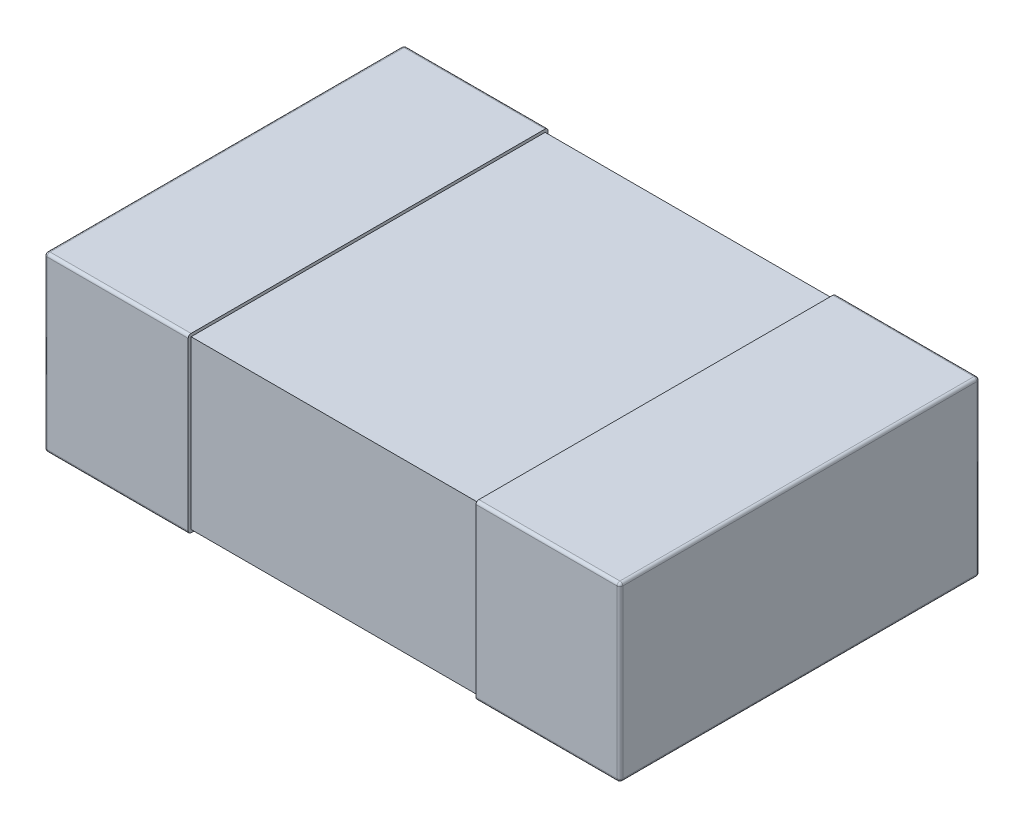
ISO-10303-21;
HEADER;
FILE_DESCRIPTION(('STEP AP214'),'2;1');
FILE_NAME('part.step','',(''),(''),'','','');
FILE_SCHEMA(('AUTOMOTIVE_DESIGN { 1 0 10303 214 1 1 1 1 }'));
ENDSEC;
DATA;
#1=APPLICATION_CONTEXT('core data for automotive mechanical design processes');
#2=APPLICATION_PROTOCOL_DEFINITION('international standard','automotive_design',2000,#1);
#3=PRODUCT_CONTEXT('',#1,'mechanical');
#4=PRODUCT('Part','Part','',(#3));
#5=PRODUCT_RELATED_PRODUCT_CATEGORY('part','',(#4));
#6=PRODUCT_DEFINITION_FORMATION('','',#4);
#7=PRODUCT_DEFINITION_CONTEXT('part definition',#1,'design');
#8=PRODUCT_DEFINITION('design','',#6,#7);
#9=PRODUCT_DEFINITION_SHAPE('','',#8);
#10=(LENGTH_UNIT() NAMED_UNIT(*) SI_UNIT(.MILLI.,.METRE.));
#11=(NAMED_UNIT(*) PLANE_ANGLE_UNIT() SI_UNIT($,.RADIAN.));
#12=(NAMED_UNIT(*) SI_UNIT($,.STERADIAN.) SOLID_ANGLE_UNIT());
#13=UNCERTAINTY_MEASURE_WITH_UNIT(LENGTH_MEASURE(1.E-05),#10,'distance_accuracy_value','');
#14=(GEOMETRIC_REPRESENTATION_CONTEXT(3) GLOBAL_UNCERTAINTY_ASSIGNED_CONTEXT((#13)) GLOBAL_UNIT_ASSIGNED_CONTEXT((#10,
#11,#12)) REPRESENTATION_CONTEXT('',''));
#15=CARTESIAN_POINT('',(0.,0.,0.));
#16=DIRECTION('',(0.,0.,1.));
#17=DIRECTION('',(1.,0.,0.));
#18=AXIS2_PLACEMENT_3D('',#15,#16,#17);
#19=CARTESIAN_POINT('',(-1.,0.3,-0.625));
#20=DIRECTION('',(1.,0.,0.));
#21=DIRECTION('',(0.,0.,-1.));
#22=AXIS2_PLACEMENT_3D('',#19,#20,#21);
#23=PLANE('',#22);
#24=DIRECTION('',(0.,-1.,0.));
#25=VECTOR('',#24,1.);
#26=CARTESIAN_POINT('',(-1.,0.3,-0.615));
#27=LINE('',#26,#25);
#28=CARTESIAN_POINT('',(-1.,0.29,-0.615));
#29=VERTEX_POINT('',#28);
#30=CARTESIAN_POINT('',(-1.,-0.29,-0.615));
#31=VERTEX_POINT('',#30);
#32=EDGE_CURVE('E347',#29,#31,#27,.T.);
#33=ORIENTED_EDGE('',*,*,#32,.T.);
#34=DIRECTION('',(0.,0.,1.));
#35=VECTOR('',#34,1.);
#36=CARTESIAN_POINT('',(-1.,-0.29,-0.625));
#37=LINE('',#36,#35);
#38=CARTESIAN_POINT('',(-1.,-0.29,0.615));
#39=VERTEX_POINT('',#38);
#40=EDGE_CURVE('E349',#31,#39,#37,.T.);
#41=ORIENTED_EDGE('',*,*,#40,.T.);
#42=DIRECTION('',(0.,-1.,0.));
#43=VECTOR('',#42,1.);
#44=CARTESIAN_POINT('',(-1.,0.3,0.615));
#45=LINE('',#44,#43);
#46=CARTESIAN_POINT('',(-1.,0.29,0.615));
#47=VERTEX_POINT('',#46);
#48=EDGE_CURVE('E345',#39,#47,#45,.F.);
#49=ORIENTED_EDGE('',*,*,#48,.T.);
#50=DIRECTION('',(0.,0.,1.));
#51=VECTOR('',#50,1.);
#52=CARTESIAN_POINT('',(-1.,0.29,-0.625));
#53=LINE('',#52,#51);
#54=EDGE_CURVE('E343',#47,#29,#53,.F.);
#55=ORIENTED_EDGE('',*,*,#54,.T.);
#56=EDGE_LOOP('',(#33,#41,#49,#55));
#57=FACE_BOUND('',#56,.T.);
#58=ADVANCED_FACE('F32',(#57),#23,.F.);
#59=CARTESIAN_POINT('',(-1.,0.3,0.625));
#60=DIRECTION('',(0.,0.,-1.));
#61=DIRECTION('',(-1.,0.,0.));
#62=AXIS2_PLACEMENT_3D('',#59,#60,#61);
#63=PLANE('',#62);
#64=DIRECTION('',(0.,-1.,0.));
#65=VECTOR('',#64,1.);
#66=CARTESIAN_POINT('',(-0.99,0.3,0.625));
#67=LINE('',#66,#65);
#68=CARTESIAN_POINT('',(-0.99,0.29,0.625));
#69=VERTEX_POINT('',#68);
#70=CARTESIAN_POINT('',(-0.99,-0.29,0.625));
#71=VERTEX_POINT('',#70);
#72=EDGE_CURVE('E375',#69,#71,#67,.T.);
#73=ORIENTED_EDGE('',*,*,#72,.T.);
#74=DIRECTION('',(1.,0.,0.));
#75=VECTOR('',#74,1.);
#76=CARTESIAN_POINT('',(-1.,-0.29,0.625));
#77=LINE('',#76,#75);
#78=CARTESIAN_POINT('',(-0.5,-0.29,0.625));
#79=VERTEX_POINT('',#78);
#80=EDGE_CURVE('E377',#71,#79,#77,.T.);
#81=ORIENTED_EDGE('',*,*,#80,.T.);
#82=DIRECTION('',(0.,-1.,0.));
#83=VECTOR('',#82,1.);
#84=CARTESIAN_POINT('',(-0.5,0.3,0.625));
#85=LINE('',#84,#83);
#86=CARTESIAN_POINT('',(-0.5,0.29,0.625));
#87=VERTEX_POINT('',#86);
#88=EDGE_CURVE('E340',#87,#79,#85,.T.);
#89=ORIENTED_EDGE('',*,*,#88,.F.);
#90=DIRECTION('',(1.,0.,0.));
#91=VECTOR('',#90,1.);
#92=CARTESIAN_POINT('',(-1.,0.29,0.625));
#93=LINE('',#92,#91);
#94=EDGE_CURVE('E373',#87,#69,#93,.F.);
#95=ORIENTED_EDGE('',*,*,#94,.T.);
#96=EDGE_LOOP('',(#73,#81,#89,#95));
#97=FACE_BOUND('',#96,.T.);
#98=ADVANCED_FACE('F446',(#97),#63,.F.);
#99=CARTESIAN_POINT('',(-0.5,0.3,-0.625));
#100=DIRECTION('',(-1.,0.,0.));
#101=DIRECTION('',(0.,0.,1.));
#102=AXIS2_PLACEMENT_3D('',#99,#100,#101);
#103=PLANE('',#102);
#104=DIRECTION('',(0.,1.,0.));
#105=VECTOR('',#104,1.);
#106=CARTESIAN_POINT('',(-0.5,0.29,-0.615));
#107=LINE('',#106,#105);
#108=CARTESIAN_POINT('',(-0.5,-0.29,-0.615));
#109=VERTEX_POINT('',#108);
#110=CARTESIAN_POINT('',(-0.5,0.29,-0.615));
#111=VERTEX_POINT('',#110);
#112=EDGE_CURVE('E206',#109,#111,#107,.T.);
#113=ORIENTED_EDGE('',*,*,#112,.F.);
#114=DIRECTION('',(0.,0.,-1.));
#115=VECTOR('',#114,1.);
#116=CARTESIAN_POINT('',(-0.5,-0.29,0.615));
#117=LINE('',#116,#115);
#118=CARTESIAN_POINT('',(-0.5,-0.29,0.615));
#119=VERTEX_POINT('',#118);
#120=EDGE_CURVE('E201',#119,#109,#117,.T.);
#121=ORIENTED_EDGE('',*,*,#120,.F.);
#122=DIRECTION('',(0.,-1.,0.));
#123=VECTOR('',#122,1.);
#124=CARTESIAN_POINT('',(-0.5,0.29,0.615));
#125=LINE('',#124,#123);
#126=CARTESIAN_POINT('',(-0.5,0.29,0.615));
#127=VERTEX_POINT('',#126);
#128=EDGE_CURVE('E322',#127,#119,#125,.T.);
#129=ORIENTED_EDGE('',*,*,#128,.F.);
#130=DIRECTION('',(0.,0.,1.));
#131=VECTOR('',#130,1.);
#132=CARTESIAN_POINT('',(-0.5,0.29,0.615));
#133=LINE('',#132,#131);
#134=EDGE_CURVE('E49',#111,#127,#133,.T.);
#135=ORIENTED_EDGE('',*,*,#134,.F.);
#136=EDGE_LOOP('',(#113,#121,#129,#135));
#137=FACE_BOUND('',#136,.T.);
#138=DIRECTION('',(0.,0.,-1.));
#139=VECTOR('',#138,1.);
#140=CARTESIAN_POINT('',(-0.5,-0.3,-0.625));
#141=LINE('',#140,#139);
#142=CARTESIAN_POINT('',(-0.5,-0.3,0.615));
#143=VERTEX_POINT('',#142);
#144=CARTESIAN_POINT('',(-0.5,-0.3,-0.615));
#145=VERTEX_POINT('',#144);
#146=EDGE_CURVE('E335',#143,#145,#141,.T.);
#147=ORIENTED_EDGE('',*,*,#146,.T.);
#148=CARTESIAN_POINT('',(-0.5,-0.29,-0.615));
#149=DIRECTION('',(-1.,0.,0.));
#150=DIRECTION('',(0.,0.,1.));
#151=AXIS2_PLACEMENT_3D('',#148,#149,#150);
#152=CIRCLE('',#151,0.01);
#153=CARTESIAN_POINT('',(-0.5,-0.29,-0.625));
#154=VERTEX_POINT('',#153);
#155=EDGE_CURVE('E371',#145,#154,#152,.F.);
#156=ORIENTED_EDGE('',*,*,#155,.T.);
#157=DIRECTION('',(0.,-1.,0.));
#158=VECTOR('',#157,1.);
#159=CARTESIAN_POINT('',(-0.5,0.3,-0.625));
#160=LINE('',#159,#158);
#161=CARTESIAN_POINT('',(-0.5,0.29,-0.625));
#162=VERTEX_POINT('',#161);
#163=EDGE_CURVE('E334',#162,#154,#160,.T.);
#164=ORIENTED_EDGE('',*,*,#163,.F.);
#165=CARTESIAN_POINT('',(-0.5,0.29,-0.615));
#166=DIRECTION('',(-1.,0.,0.));
#167=DIRECTION('',(0.,0.,1.));
#168=AXIS2_PLACEMENT_3D('',#165,#166,#167);
#169=CIRCLE('',#168,0.01);
#170=CARTESIAN_POINT('',(-0.5,0.3,-0.615));
#171=VERTEX_POINT('',#170);
#172=EDGE_CURVE('E367',#162,#171,#169,.F.);
#173=ORIENTED_EDGE('',*,*,#172,.T.);
#174=DIRECTION('',(0.,0.,-1.));
#175=VECTOR('',#174,1.);
#176=CARTESIAN_POINT('',(-0.5,0.3,-0.625));
#177=LINE('',#176,#175);
#178=CARTESIAN_POINT('',(-0.5,0.3,0.615));
#179=VERTEX_POINT('',#178);
#180=EDGE_CURVE('E332',#179,#171,#177,.T.);
#181=ORIENTED_EDGE('',*,*,#180,.F.);
#182=CARTESIAN_POINT('',(-0.5,0.29,0.615));
#183=DIRECTION('',(-1.,0.,0.));
#184=DIRECTION('',(0.,0.,1.));
#185=AXIS2_PLACEMENT_3D('',#182,#183,#184);
#186=CIRCLE('',#185,0.01);
#187=EDGE_CURVE('E365',#179,#87,#186,.F.);
#188=ORIENTED_EDGE('',*,*,#187,.T.);
#189=ORIENTED_EDGE('',*,*,#88,.T.);
#190=CARTESIAN_POINT('',(-0.5,-0.29,0.615));
#191=DIRECTION('',(-1.,0.,0.));
#192=DIRECTION('',(0.,0.,1.));
#193=AXIS2_PLACEMENT_3D('',#190,#191,#192);
#194=CIRCLE('',#193,0.01);
#195=EDGE_CURVE('E369',#79,#143,#194,.F.);
#196=ORIENTED_EDGE('',*,*,#195,.T.);
#197=EDGE_LOOP('',(#147,#156,#164,#173,#181,#188,#189,#196));
#198=FACE_BOUND('',#197,.T.);
#199=ADVANCED_FACE('F443',(#137,#198),#103,.F.);
#200=CARTESIAN_POINT('',(-1.,0.3,-0.625));
#201=DIRECTION('',(0.,0.,1.));
#202=DIRECTION('',(1.,0.,0.));
#203=AXIS2_PLACEMENT_3D('',#200,#201,#202);
#204=PLANE('',#203);
#205=ORIENTED_EDGE('',*,*,#163,.T.);
#206=DIRECTION('',(-1.,0.,0.));
#207=VECTOR('',#206,1.);
#208=CARTESIAN_POINT('',(-1.,-0.29,-0.625));
#209=LINE('',#208,#207);
#210=CARTESIAN_POINT('',(-0.99,-0.29,-0.625));
#211=VERTEX_POINT('',#210);
#212=EDGE_CURVE('E363',#154,#211,#209,.T.);
#213=ORIENTED_EDGE('',*,*,#212,.T.);
#214=DIRECTION('',(0.,-1.,0.));
#215=VECTOR('',#214,1.);
#216=CARTESIAN_POINT('',(-0.99,0.3,-0.625));
#217=LINE('',#216,#215);
#218=CARTESIAN_POINT('',(-0.99,0.29,-0.625));
#219=VERTEX_POINT('',#218);
#220=EDGE_CURVE('E361',#211,#219,#217,.F.);
#221=ORIENTED_EDGE('',*,*,#220,.T.);
#222=DIRECTION('',(-1.,0.,0.));
#223=VECTOR('',#222,1.);
#224=CARTESIAN_POINT('',(-0.5,0.29,-0.625));
#225=LINE('',#224,#223);
#226=EDGE_CURVE('E359',#219,#162,#225,.F.);
#227=ORIENTED_EDGE('',*,*,#226,.T.);
#228=EDGE_LOOP('',(#205,#213,#221,#227));
#229=FACE_BOUND('',#228,.T.);
#230=ADVANCED_FACE('F472',(#229),#204,.F.);
#231=CARTESIAN_POINT('',(-1.,0.3,0.625));
#232=DIRECTION('',(0.,1.,0.));
#233=DIRECTION('',(0.,0.,1.));
#234=AXIS2_PLACEMENT_3D('',#231,#232,#233);
#235=PLANE('',#234);
#236=ORIENTED_EDGE('',*,*,#180,.T.);
#237=DIRECTION('',(-1.,0.,0.));
#238=VECTOR('',#237,1.);
#239=CARTESIAN_POINT('',(-1.,0.3,-0.615));
#240=LINE('',#239,#238);
#241=CARTESIAN_POINT('',(-0.99,0.3,-0.615));
#242=VERTEX_POINT('',#241);
#243=EDGE_CURVE('E11',#171,#242,#240,.T.);
#244=ORIENTED_EDGE('',*,*,#243,.T.);
#245=DIRECTION('',(0.,0.,1.));
#246=VECTOR('',#245,1.);
#247=CARTESIAN_POINT('',(-0.99,0.3,0.625));
#248=LINE('',#247,#246);
#249=CARTESIAN_POINT('',(-0.99,0.3,0.615));
#250=VERTEX_POINT('',#249);
#251=EDGE_CURVE('E41',#242,#250,#248,.T.);
#252=ORIENTED_EDGE('',*,*,#251,.T.);
#253=DIRECTION('',(1.,0.,0.));
#254=VECTOR('',#253,1.);
#255=CARTESIAN_POINT('',(-0.5,0.3,0.615));
#256=LINE('',#255,#254);
#257=EDGE_CURVE('E379',#250,#179,#256,.T.);
#258=ORIENTED_EDGE('',*,*,#257,.T.);
#259=EDGE_LOOP('',(#236,#244,#252,#258));
#260=FACE_BOUND('',#259,.T.);
#261=ADVANCED_FACE('F433',(#260),#235,.T.);
#262=CARTESIAN_POINT('',(-1.,-0.3,0.625));
#263=DIRECTION('',(0.,1.,0.));
#264=DIRECTION('',(0.,0.,1.));
#265=AXIS2_PLACEMENT_3D('',#262,#263,#264);
#266=PLANE('',#265);
#267=DIRECTION('',(0.,0.,1.));
#268=VECTOR('',#267,1.);
#269=CARTESIAN_POINT('',(-0.99,-0.3,0.625));
#270=LINE('',#269,#268);
#271=CARTESIAN_POINT('',(-0.99,-0.3,0.615));
#272=VERTEX_POINT('',#271);
#273=CARTESIAN_POINT('',(-0.99,-0.3,-0.615));
#274=VERTEX_POINT('',#273);
#275=EDGE_CURVE('E354',#272,#274,#270,.F.);
#276=ORIENTED_EDGE('',*,*,#275,.T.);
#277=DIRECTION('',(-1.,0.,0.));
#278=VECTOR('',#277,1.);
#279=CARTESIAN_POINT('',(-1.,-0.3,-0.615));
#280=LINE('',#279,#278);
#281=EDGE_CURVE('E357',#274,#145,#280,.F.);
#282=ORIENTED_EDGE('',*,*,#281,.T.);
#283=ORIENTED_EDGE('',*,*,#146,.F.);
#284=DIRECTION('',(1.,0.,0.));
#285=VECTOR('',#284,1.);
#286=CARTESIAN_POINT('',(-1.,-0.3,0.615));
#287=LINE('',#286,#285);
#288=EDGE_CURVE('E352',#143,#272,#287,.F.);
#289=ORIENTED_EDGE('',*,*,#288,.T.);
#290=EDGE_LOOP('',(#276,#282,#283,#289));
#291=FACE_BOUND('',#290,.T.);
#292=ADVANCED_FACE('F463',(#291),#266,.F.);
#293=CARTESIAN_POINT('',(-1.,0.29,-0.615));
#294=DIRECTION('',(1.,0.,0.));
#295=DIRECTION('',(0.,0.,-1.));
#296=AXIS2_PLACEMENT_3D('',#293,#294,#295);
#297=CYLINDRICAL_SURFACE('',#296,0.01);
#298=ORIENTED_EDGE('',*,*,#172,.F.);
#299=ORIENTED_EDGE('',*,*,#226,.F.);
#300=CARTESIAN_POINT('',(-0.99,0.29,-0.615));
#301=DIRECTION('',(-1.,0.,0.));
#302=DIRECTION('',(0.,0.,1.));
#303=AXIS2_PLACEMENT_3D('',#300,#301,#302);
#304=CIRCLE('',#303,0.01);
#305=EDGE_CURVE('E36',#242,#219,#304,.T.);
#306=ORIENTED_EDGE('',*,*,#305,.F.);
#307=ORIENTED_EDGE('',*,*,#243,.F.);
#308=EDGE_LOOP('',(#298,#299,#306,#307));
#309=FACE_BOUND('',#308,.T.);
#310=ADVANCED_FACE('F34',(#309),#297,.T.);
#311=CARTESIAN_POINT('',(-0.99,0.29,0.625));
#312=DIRECTION('',(0.,0.,-1.));
#313=DIRECTION('',(-1.,0.,0.));
#314=AXIS2_PLACEMENT_3D('',#311,#312,#313);
#315=CYLINDRICAL_SURFACE('',#314,0.01);
#316=CARTESIAN_POINT('',(-0.99,0.29,0.615));
#317=DIRECTION('',(0.,0.,1.));
#318=DIRECTION('',(1.,0.,0.));
#319=AXIS2_PLACEMENT_3D('',#316,#317,#318);
#320=CIRCLE('',#319,0.01);
#321=EDGE_CURVE('E406',#250,#47,#320,.T.);
#322=ORIENTED_EDGE('',*,*,#321,.F.);
#323=ORIENTED_EDGE('',*,*,#251,.F.);
#324=CARTESIAN_POINT('',(-0.99,0.29,-0.615));
#325=DIRECTION('',(0.,0.,-1.));
#326=DIRECTION('',(-1.,0.,0.));
#327=AXIS2_PLACEMENT_3D('',#324,#325,#326);
#328=CIRCLE('',#327,0.01);
#329=EDGE_CURVE('E408',#29,#242,#328,.T.);
#330=ORIENTED_EDGE('',*,*,#329,.F.);
#331=ORIENTED_EDGE('',*,*,#54,.F.);
#332=EDGE_LOOP('',(#322,#323,#330,#331));
#333=FACE_BOUND('',#332,.T.);
#334=ADVANCED_FACE('F431',(#333),#315,.T.);
#335=CARTESIAN_POINT('',(-1.,0.29,0.615));
#336=DIRECTION('',(-1.,0.,0.));
#337=DIRECTION('',(0.,0.,1.));
#338=AXIS2_PLACEMENT_3D('',#335,#336,#337);
#339=CYLINDRICAL_SURFACE('',#338,0.01);
#340=ORIENTED_EDGE('',*,*,#187,.F.);
#341=ORIENTED_EDGE('',*,*,#257,.F.);
#342=CARTESIAN_POINT('',(-0.99,0.29,0.615));
#343=DIRECTION('',(-1.,0.,0.));
#344=DIRECTION('',(0.,0.,1.));
#345=AXIS2_PLACEMENT_3D('',#342,#343,#344);
#346=CIRCLE('',#345,0.01);
#347=EDGE_CURVE('E403',#69,#250,#346,.T.);
#348=ORIENTED_EDGE('',*,*,#347,.F.);
#349=ORIENTED_EDGE('',*,*,#94,.F.);
#350=EDGE_LOOP('',(#340,#341,#348,#349));
#351=FACE_BOUND('',#350,.T.);
#352=ADVANCED_FACE('F438',(#351),#339,.T.);
#353=CARTESIAN_POINT('',(-0.99,0.29,-0.615));
#354=DIRECTION('',(0.,0.,1.));
#355=DIRECTION('',(1.,0.,0.));
#356=AXIS2_PLACEMENT_3D('',#353,#354,#355);
#357=SPHERICAL_SURFACE('',#356,0.01);
#358=ORIENTED_EDGE('',*,*,#329,.T.);
#359=ORIENTED_EDGE('',*,*,#305,.T.);
#360=CARTESIAN_POINT('',(-0.99,0.29,-0.615));
#361=DIRECTION('',(0.,1.,0.));
#362=DIRECTION('',(0.,0.,1.));
#363=AXIS2_PLACEMENT_3D('',#360,#361,#362);
#364=CIRCLE('',#363,0.01);
#365=EDGE_CURVE('E400',#29,#219,#364,.F.);
#366=ORIENTED_EDGE('',*,*,#365,.F.);
#367=EDGE_LOOP('',(#358,#359,#366));
#368=FACE_BOUND('',#367,.T.);
#369=ADVANCED_FACE('F415',(#368),#357,.T.);
#370=CARTESIAN_POINT('',(-0.99,0.29,0.615));
#371=DIRECTION('',(0.,0.,1.));
#372=DIRECTION('',(1.,0.,0.));
#373=AXIS2_PLACEMENT_3D('',#370,#371,#372);
#374=SPHERICAL_SURFACE('',#373,0.01);
#375=ORIENTED_EDGE('',*,*,#347,.T.);
#376=ORIENTED_EDGE('',*,*,#321,.T.);
#377=CARTESIAN_POINT('',(-0.99,0.29,0.615));
#378=DIRECTION('',(0.,1.,0.));
#379=DIRECTION('',(0.,0.,1.));
#380=AXIS2_PLACEMENT_3D('',#377,#378,#379);
#381=CIRCLE('',#380,0.01);
#382=EDGE_CURVE('E397',#69,#47,#381,.F.);
#383=ORIENTED_EDGE('',*,*,#382,.F.);
#384=EDGE_LOOP('',(#375,#376,#383));
#385=FACE_BOUND('',#384,.T.);
#386=ADVANCED_FACE('F504',(#385),#374,.T.);
#387=CARTESIAN_POINT('',(-1.,-0.29,-0.615));
#388=DIRECTION('',(-1.,0.,0.));
#389=DIRECTION('',(0.,0.,1.));
#390=AXIS2_PLACEMENT_3D('',#387,#388,#389);
#391=CYLINDRICAL_SURFACE('',#390,0.01);
#392=ORIENTED_EDGE('',*,*,#155,.F.);
#393=ORIENTED_EDGE('',*,*,#281,.F.);
#394=CARTESIAN_POINT('',(-0.99,-0.29,-0.615));
#395=DIRECTION('',(-1.,0.,0.));
#396=DIRECTION('',(0.,0.,1.));
#397=AXIS2_PLACEMENT_3D('',#394,#395,#396);
#398=CIRCLE('',#397,0.01);
#399=EDGE_CURVE('E394',#211,#274,#398,.T.);
#400=ORIENTED_EDGE('',*,*,#399,.F.);
#401=ORIENTED_EDGE('',*,*,#212,.F.);
#402=EDGE_LOOP('',(#392,#393,#400,#401));
#403=FACE_BOUND('',#402,.T.);
#404=ADVANCED_FACE('F470',(#403),#391,.T.);
#405=CARTESIAN_POINT('',(-0.99,0.3,-0.615));
#406=DIRECTION('',(0.,-1.,0.));
#407=DIRECTION('',(0.,0.,-1.));
#408=AXIS2_PLACEMENT_3D('',#405,#406,#407);
#409=CYLINDRICAL_SURFACE('',#408,0.01);
#410=ORIENTED_EDGE('',*,*,#365,.T.);
#411=ORIENTED_EDGE('',*,*,#220,.F.);
#412=CARTESIAN_POINT('',(-0.99,-0.29,-0.615));
#413=DIRECTION('',(0.,-1.,0.));
#414=DIRECTION('',(0.,0.,-1.));
#415=AXIS2_PLACEMENT_3D('',#412,#413,#414);
#416=CIRCLE('',#415,0.01);
#417=EDGE_CURVE('E391',#31,#211,#416,.T.);
#418=ORIENTED_EDGE('',*,*,#417,.F.);
#419=ORIENTED_EDGE('',*,*,#32,.F.);
#420=EDGE_LOOP('',(#410,#411,#418,#419));
#421=FACE_BOUND('',#420,.T.);
#422=ADVANCED_FACE('F421',(#421),#409,.T.);
#423=CARTESIAN_POINT('',(-0.99,0.3,0.615));
#424=DIRECTION('',(0.,-1.,0.));
#425=DIRECTION('',(0.,0.,-1.));
#426=AXIS2_PLACEMENT_3D('',#423,#424,#425);
#427=CYLINDRICAL_SURFACE('',#426,0.01);
#428=ORIENTED_EDGE('',*,*,#382,.T.);
#429=ORIENTED_EDGE('',*,*,#48,.F.);
#430=CARTESIAN_POINT('',(-0.99,-0.29,0.615));
#431=DIRECTION('',(0.,-1.,0.));
#432=DIRECTION('',(0.,0.,-1.));
#433=AXIS2_PLACEMENT_3D('',#430,#431,#432);
#434=CIRCLE('',#433,0.01);
#435=EDGE_CURVE('E388',#71,#39,#434,.T.);
#436=ORIENTED_EDGE('',*,*,#435,.F.);
#437=ORIENTED_EDGE('',*,*,#72,.F.);
#438=EDGE_LOOP('',(#428,#429,#436,#437));
#439=FACE_BOUND('',#438,.T.);
#440=ADVANCED_FACE('F456',(#439),#427,.T.);
#441=CARTESIAN_POINT('',(-1.,-0.29,0.615));
#442=DIRECTION('',(1.,0.,0.));
#443=DIRECTION('',(0.,0.,-1.));
#444=AXIS2_PLACEMENT_3D('',#441,#442,#443);
#445=CYLINDRICAL_SURFACE('',#444,0.01);
#446=ORIENTED_EDGE('',*,*,#195,.F.);
#447=ORIENTED_EDGE('',*,*,#80,.F.);
#448=CARTESIAN_POINT('',(-0.99,-0.29,0.615));
#449=DIRECTION('',(-1.,0.,0.));
#450=DIRECTION('',(0.,0.,1.));
#451=AXIS2_PLACEMENT_3D('',#448,#449,#450);
#452=CIRCLE('',#451,0.01);
#453=EDGE_CURVE('E385',#272,#71,#452,.T.);
#454=ORIENTED_EDGE('',*,*,#453,.F.);
#455=ORIENTED_EDGE('',*,*,#288,.F.);
#456=EDGE_LOOP('',(#446,#447,#454,#455));
#457=FACE_BOUND('',#456,.T.);
#458=ADVANCED_FACE('F452',(#457),#445,.T.);
#459=CARTESIAN_POINT('',(-0.99,-0.29,-0.615));
#460=DIRECTION('',(0.,0.,1.));
#461=DIRECTION('',(1.,0.,0.));
#462=AXIS2_PLACEMENT_3D('',#459,#460,#461);
#463=SPHERICAL_SURFACE('',#462,0.01);
#464=ORIENTED_EDGE('',*,*,#417,.T.);
#465=ORIENTED_EDGE('',*,*,#399,.T.);
#466=CARTESIAN_POINT('',(-0.99,-0.29,-0.615));
#467=DIRECTION('',(0.,0.,-1.));
#468=DIRECTION('',(-1.,0.,0.));
#469=AXIS2_PLACEMENT_3D('',#466,#467,#468);
#470=CIRCLE('',#469,0.01);
#471=EDGE_CURVE('E383',#31,#274,#470,.F.);
#472=ORIENTED_EDGE('',*,*,#471,.F.);
#473=EDGE_LOOP('',(#464,#465,#472));
#474=FACE_BOUND('',#473,.T.);
#475=ADVANCED_FACE('F492',(#474),#463,.T.);
#476=CARTESIAN_POINT('',(-0.99,-0.29,0.615));
#477=DIRECTION('',(0.,0.,1.));
#478=DIRECTION('',(1.,0.,0.));
#479=AXIS2_PLACEMENT_3D('',#476,#477,#478);
#480=SPHERICAL_SURFACE('',#479,0.01);
#481=ORIENTED_EDGE('',*,*,#453,.T.);
#482=ORIENTED_EDGE('',*,*,#435,.T.);
#483=CARTESIAN_POINT('',(-0.99,-0.29,0.615));
#484=DIRECTION('',(0.,0.,1.));
#485=DIRECTION('',(1.,0.,0.));
#486=AXIS2_PLACEMENT_3D('',#483,#484,#485);
#487=CIRCLE('',#486,0.01);
#488=EDGE_CURVE('E331',#272,#39,#487,.F.);
#489=ORIENTED_EDGE('',*,*,#488,.F.);
#490=EDGE_LOOP('',(#481,#482,#489));
#491=FACE_BOUND('',#490,.T.);
#492=ADVANCED_FACE('F459',(#491),#480,.T.);
#493=CARTESIAN_POINT('',(-0.99,-0.29,-0.625));
#494=DIRECTION('',(0.,0.,1.));
#495=DIRECTION('',(1.,0.,0.));
#496=AXIS2_PLACEMENT_3D('',#493,#494,#495);
#497=CYLINDRICAL_SURFACE('',#496,0.01);
#498=ORIENTED_EDGE('',*,*,#471,.T.);
#499=ORIENTED_EDGE('',*,*,#275,.F.);
#500=ORIENTED_EDGE('',*,*,#488,.T.);
#501=ORIENTED_EDGE('',*,*,#40,.F.);
#502=EDGE_LOOP('',(#498,#499,#500,#501));
#503=FACE_BOUND('',#502,.T.);
#504=ADVANCED_FACE('F461',(#503),#497,.T.);
#505=CARTESIAN_POINT('',(-1.85988970140964,-0.29,0.615));
#506=DIRECTION('',(0.,-1.,0.));
#507=DIRECTION('',(0.,0.,-1.));
#508=AXIS2_PLACEMENT_3D('',#505,#506,#507);
#509=PLANE('',#508);
#510=DIRECTION('',(1.,0.,0.));
#511=VECTOR('',#510,1.);
#512=CARTESIAN_POINT('',(-1.85988970140964,-0.29,0.615));
#513=LINE('',#512,#511);
#514=CARTESIAN_POINT('',(0.5,-0.29,0.615));
#515=VERTEX_POINT('',#514);
#516=EDGE_CURVE('E324',#119,#515,#513,.T.);
#517=ORIENTED_EDGE('',*,*,#516,.F.);
#518=ORIENTED_EDGE('',*,*,#120,.T.);
#519=DIRECTION('',(1.,0.,0.));
#520=VECTOR('',#519,1.);
#521=CARTESIAN_POINT('',(-1.85988970140964,-0.29,-0.615));
#522=LINE('',#521,#520);
#523=CARTESIAN_POINT('',(0.5,-0.29,-0.615));
#524=VERTEX_POINT('',#523);
#525=EDGE_CURVE('E194',#109,#524,#522,.T.);
#526=ORIENTED_EDGE('',*,*,#525,.T.);
#527=DIRECTION('',(0.,0.,-1.));
#528=VECTOR('',#527,1.);
#529=CARTESIAN_POINT('',(0.5,-0.29,0.615));
#530=LINE('',#529,#528);
#531=EDGE_CURVE('E198',#515,#524,#530,.T.);
#532=ORIENTED_EDGE('',*,*,#531,.F.);
#533=EDGE_LOOP('',(#517,#518,#526,#532));
#534=FACE_BOUND('',#533,.T.);
#535=ADVANCED_FACE('F197',(#534),#509,.T.);
#536=CARTESIAN_POINT('',(-1.85988970140964,0.29,-0.615));
#537=DIRECTION('',(0.,0.,-1.));
#538=DIRECTION('',(-1.,0.,0.));
#539=AXIS2_PLACEMENT_3D('',#536,#537,#538);
#540=PLANE('',#539);
#541=ORIENTED_EDGE('',*,*,#525,.F.);
#542=ORIENTED_EDGE('',*,*,#112,.T.);
#543=DIRECTION('',(1.,0.,0.));
#544=VECTOR('',#543,1.);
#545=CARTESIAN_POINT('',(-1.85988970140964,0.29,-0.615));
#546=LINE('',#545,#544);
#547=CARTESIAN_POINT('',(0.5,0.29,-0.615));
#548=VERTEX_POINT('',#547);
#549=EDGE_CURVE('E218',#111,#548,#546,.T.);
#550=ORIENTED_EDGE('',*,*,#549,.T.);
#551=DIRECTION('',(0.,1.,0.));
#552=VECTOR('',#551,1.);
#553=CARTESIAN_POINT('',(0.5,0.29,-0.615));
#554=LINE('',#553,#552);
#555=EDGE_CURVE('E213',#524,#548,#554,.T.);
#556=ORIENTED_EDGE('',*,*,#555,.F.);
#557=EDGE_LOOP('',(#541,#542,#550,#556));
#558=FACE_BOUND('',#557,.T.);
#559=ADVANCED_FACE('F217',(#558),#540,.T.);
#560=CARTESIAN_POINT('',(-1.85988970140964,0.29,0.615));
#561=DIRECTION('',(0.,1.,0.));
#562=DIRECTION('',(0.,0.,1.));
#563=AXIS2_PLACEMENT_3D('',#560,#561,#562);
#564=PLANE('',#563);
#565=ORIENTED_EDGE('',*,*,#549,.F.);
#566=ORIENTED_EDGE('',*,*,#134,.T.);
#567=DIRECTION('',(1.,0.,0.));
#568=VECTOR('',#567,1.);
#569=CARTESIAN_POINT('',(-1.85988970140964,0.29,0.615));
#570=LINE('',#569,#568);
#571=CARTESIAN_POINT('',(0.5,0.29,0.615));
#572=VERTEX_POINT('',#571);
#573=EDGE_CURVE('E325',#127,#572,#570,.T.);
#574=ORIENTED_EDGE('',*,*,#573,.T.);
#575=DIRECTION('',(0.,0.,1.));
#576=VECTOR('',#575,1.);
#577=CARTESIAN_POINT('',(0.5,0.29,0.615));
#578=LINE('',#577,#576);
#579=EDGE_CURVE('E220',#548,#572,#578,.T.);
#580=ORIENTED_EDGE('',*,*,#579,.F.);
#581=EDGE_LOOP('',(#565,#566,#574,#580));
#582=FACE_BOUND('',#581,.T.);
#583=ADVANCED_FACE('F564',(#582),#564,.T.);
#584=CARTESIAN_POINT('',(-1.85988970140964,0.29,0.615));
#585=DIRECTION('',(0.,0.,1.));
#586=DIRECTION('',(1.,0.,0.));
#587=AXIS2_PLACEMENT_3D('',#584,#585,#586);
#588=PLANE('',#587);
#589=ORIENTED_EDGE('',*,*,#573,.F.);
#590=ORIENTED_EDGE('',*,*,#128,.T.);
#591=ORIENTED_EDGE('',*,*,#516,.T.);
#592=DIRECTION('',(0.,-1.,0.));
#593=VECTOR('',#592,1.);
#594=CARTESIAN_POINT('',(0.5,0.29,0.615));
#595=LINE('',#594,#593);
#596=EDGE_CURVE('E215',#572,#515,#595,.T.);
#597=ORIENTED_EDGE('',*,*,#596,.F.);
#598=EDGE_LOOP('',(#589,#590,#591,#597));
#599=FACE_BOUND('',#598,.T.);
#600=ADVANCED_FACE('F571',(#599),#588,.T.);
#601=CARTESIAN_POINT('',(1.,0.3,-0.625));
#602=DIRECTION('',(-1.,0.,0.));
#603=DIRECTION('',(0.,0.,-1.));
#604=AXIS2_PLACEMENT_3D('',#601,#602,#603);
#605=PLANE('',#604);
#606=DIRECTION('',(0.,-1.,0.));
#607=VECTOR('',#606,1.);
#608=CARTESIAN_POINT('',(1.,0.3,-0.615));
#609=LINE('',#608,#607);
#610=CARTESIAN_POINT('',(1.,0.29,-0.615));
#611=VERTEX_POINT('',#610);
#612=CARTESIAN_POINT('',(1.,-0.29,-0.615));
#613=VERTEX_POINT('',#612);
#614=EDGE_CURVE('E244',#611,#613,#609,.T.);
#615=ORIENTED_EDGE('',*,*,#614,.F.);
#616=DIRECTION('',(0.,0.,1.));
#617=VECTOR('',#616,1.);
#618=CARTESIAN_POINT('',(1.,0.29,-0.625));
#619=LINE('',#618,#617);
#620=CARTESIAN_POINT('',(1.,0.29,0.615));
#621=VERTEX_POINT('',#620);
#622=EDGE_CURVE('E238',#621,#611,#619,.F.);
#623=ORIENTED_EDGE('',*,*,#622,.F.);
#624=DIRECTION('',(0.,-1.,0.));
#625=VECTOR('',#624,1.);
#626=CARTESIAN_POINT('',(1.,0.3,0.615));
#627=LINE('',#626,#625);
#628=CARTESIAN_POINT('',(1.,-0.29,0.615));
#629=VERTEX_POINT('',#628);
#630=EDGE_CURVE('E241',#629,#621,#627,.F.);
#631=ORIENTED_EDGE('',*,*,#630,.F.);
#632=DIRECTION('',(0.,0.,1.));
#633=VECTOR('',#632,1.);
#634=CARTESIAN_POINT('',(1.,-0.29,-0.625));
#635=LINE('',#634,#633);
#636=EDGE_CURVE('E247',#613,#629,#635,.T.);
#637=ORIENTED_EDGE('',*,*,#636,.F.);
#638=EDGE_LOOP('',(#615,#623,#631,#637));
#639=FACE_BOUND('',#638,.T.);
#640=ADVANCED_FACE('F578',(#639),#605,.F.);
#641=CARTESIAN_POINT('',(1.,0.3,0.625));
#642=DIRECTION('',(0.,0.,-1.));
#643=DIRECTION('',(1.,0.,0.));
#644=AXIS2_PLACEMENT_3D('',#641,#642,#643);
#645=PLANE('',#644);
#646=DIRECTION('',(0.,-1.,0.));
#647=VECTOR('',#646,1.);
#648=CARTESIAN_POINT('',(0.99,0.3,0.625));
#649=LINE('',#648,#647);
#650=CARTESIAN_POINT('',(0.99,0.29,0.625));
#651=VERTEX_POINT('',#650);
#652=CARTESIAN_POINT('',(0.99,-0.29,0.625));
#653=VERTEX_POINT('',#652);
#654=EDGE_CURVE('E280',#651,#653,#649,.T.);
#655=ORIENTED_EDGE('',*,*,#654,.F.);
#656=DIRECTION('',(-1.,0.,0.));
#657=VECTOR('',#656,1.);
#658=CARTESIAN_POINT('',(1.,0.29,0.625));
#659=LINE('',#658,#657);
#660=CARTESIAN_POINT('',(0.5,0.29,0.625));
#661=VERTEX_POINT('',#660);
#662=EDGE_CURVE('E277',#661,#651,#659,.F.);
#663=ORIENTED_EDGE('',*,*,#662,.F.);
#664=DIRECTION('',(0.,-1.,0.));
#665=VECTOR('',#664,1.);
#666=CARTESIAN_POINT('',(0.5,0.3,0.625));
#667=LINE('',#666,#665);
#668=CARTESIAN_POINT('',(0.5,-0.29,0.625));
#669=VERTEX_POINT('',#668);
#670=EDGE_CURVE('E235',#661,#669,#667,.T.);
#671=ORIENTED_EDGE('',*,*,#670,.T.);
#672=DIRECTION('',(-1.,0.,0.));
#673=VECTOR('',#672,1.);
#674=CARTESIAN_POINT('',(1.,-0.29,0.625));
#675=LINE('',#674,#673);
#676=EDGE_CURVE('E283',#653,#669,#675,.T.);
#677=ORIENTED_EDGE('',*,*,#676,.F.);
#678=EDGE_LOOP('',(#655,#663,#671,#677));
#679=FACE_BOUND('',#678,.T.);
#680=ADVANCED_FACE('F587',(#679),#645,.F.);
#681=CARTESIAN_POINT('',(0.5,0.3,-0.625));
#682=DIRECTION('',(1.,0.,0.));
#683=DIRECTION('',(0.,0.,1.));
#684=AXIS2_PLACEMENT_3D('',#681,#682,#683);
#685=PLANE('',#684);
#686=ORIENTED_EDGE('',*,*,#555,.T.);
#687=ORIENTED_EDGE('',*,*,#579,.T.);
#688=ORIENTED_EDGE('',*,*,#596,.T.);
#689=ORIENTED_EDGE('',*,*,#531,.T.);
#690=EDGE_LOOP('',(#686,#687,#688,#689));
#691=FACE_BOUND('',#690,.T.);
#692=DIRECTION('',(0.,0.,-1.));
#693=VECTOR('',#692,1.);
#694=CARTESIAN_POINT('',(0.5,-0.3,-0.625));
#695=LINE('',#694,#693);
#696=CARTESIAN_POINT('',(0.5,-0.3,0.615));
#697=VERTEX_POINT('',#696);
#698=CARTESIAN_POINT('',(0.5,-0.3,-0.615));
#699=VERTEX_POINT('',#698);
#700=EDGE_CURVE('E229',#697,#699,#695,.T.);
#701=ORIENTED_EDGE('',*,*,#700,.F.);
#702=CARTESIAN_POINT('',(0.5,-0.29,0.615));
#703=DIRECTION('',(-1.,0.,0.));
#704=DIRECTION('',(0.,0.,1.));
#705=AXIS2_PLACEMENT_3D('',#702,#703,#704);
#706=CIRCLE('',#705,0.01);
#707=EDGE_CURVE('E271',#669,#697,#706,.F.);
#708=ORIENTED_EDGE('',*,*,#707,.F.);
#709=ORIENTED_EDGE('',*,*,#670,.F.);
#710=CARTESIAN_POINT('',(0.5,0.29,0.615));
#711=DIRECTION('',(-1.,0.,0.));
#712=DIRECTION('',(0.,0.,1.));
#713=AXIS2_PLACEMENT_3D('',#710,#711,#712);
#714=CIRCLE('',#713,0.01);
#715=CARTESIAN_POINT('',(0.5,0.3,0.615));
#716=VERTEX_POINT('',#715);
#717=EDGE_CURVE('E266',#716,#661,#714,.F.);
#718=ORIENTED_EDGE('',*,*,#717,.F.);
#719=DIRECTION('',(0.,0.,-1.));
#720=VECTOR('',#719,1.);
#721=CARTESIAN_POINT('',(0.5,0.3,-0.625));
#722=LINE('',#721,#720);
#723=CARTESIAN_POINT('',(0.5,0.3,-0.615));
#724=VERTEX_POINT('',#723);
#725=EDGE_CURVE('E225',#716,#724,#722,.T.);
#726=ORIENTED_EDGE('',*,*,#725,.T.);
#727=CARTESIAN_POINT('',(0.5,0.29,-0.615));
#728=DIRECTION('',(-1.,0.,0.));
#729=DIRECTION('',(0.,0.,1.));
#730=AXIS2_PLACEMENT_3D('',#727,#728,#729);
#731=CIRCLE('',#730,0.01);
#732=CARTESIAN_POINT('',(0.5,0.29,-0.625));
#733=VERTEX_POINT('',#732);
#734=EDGE_CURVE('E268',#733,#724,#731,.F.);
#735=ORIENTED_EDGE('',*,*,#734,.F.);
#736=DIRECTION('',(0.,-1.,0.));
#737=VECTOR('',#736,1.);
#738=CARTESIAN_POINT('',(0.5,0.3,-0.625));
#739=LINE('',#738,#737);
#740=CARTESIAN_POINT('',(0.5,-0.29,-0.625));
#741=VERTEX_POINT('',#740);
#742=EDGE_CURVE('E228',#733,#741,#739,.T.);
#743=ORIENTED_EDGE('',*,*,#742,.T.);
#744=CARTESIAN_POINT('',(0.5,-0.29,-0.615));
#745=DIRECTION('',(-1.,0.,0.));
#746=DIRECTION('',(0.,0.,1.));
#747=AXIS2_PLACEMENT_3D('',#744,#745,#746);
#748=CIRCLE('',#747,0.01);
#749=EDGE_CURVE('E274',#699,#741,#748,.F.);
#750=ORIENTED_EDGE('',*,*,#749,.F.);
#751=EDGE_LOOP('',(#701,#708,#709,#718,#726,#735,#743,#750));
#752=FACE_BOUND('',#751,.T.);
#753=ADVANCED_FACE('F210',(#691,#752),#685,.F.);
#754=CARTESIAN_POINT('',(1.,0.3,-0.625));
#755=DIRECTION('',(0.,0.,1.));
#756=DIRECTION('',(-1.,0.,0.));
#757=AXIS2_PLACEMENT_3D('',#754,#755,#756);
#758=PLANE('',#757);
#759=ORIENTED_EDGE('',*,*,#742,.F.);
#760=DIRECTION('',(1.,0.,0.));
#761=VECTOR('',#760,1.);
#762=CARTESIAN_POINT('',(0.5,0.29,-0.625));
#763=LINE('',#762,#761);
#764=CARTESIAN_POINT('',(0.99,0.29,-0.625));
#765=VERTEX_POINT('',#764);
#766=EDGE_CURVE('E258',#765,#733,#763,.F.);
#767=ORIENTED_EDGE('',*,*,#766,.F.);
#768=DIRECTION('',(0.,-1.,0.));
#769=VECTOR('',#768,1.);
#770=CARTESIAN_POINT('',(0.99,0.3,-0.625));
#771=LINE('',#770,#769);
#772=CARTESIAN_POINT('',(0.99,-0.29,-0.625));
#773=VERTEX_POINT('',#772);
#774=EDGE_CURVE('E260',#773,#765,#771,.F.);
#775=ORIENTED_EDGE('',*,*,#774,.F.);
#776=DIRECTION('',(1.,0.,0.));
#777=VECTOR('',#776,1.);
#778=CARTESIAN_POINT('',(1.,-0.29,-0.625));
#779=LINE('',#778,#777);
#780=EDGE_CURVE('E263',#741,#773,#779,.T.);
#781=ORIENTED_EDGE('',*,*,#780,.F.);
#782=EDGE_LOOP('',(#759,#767,#775,#781));
#783=FACE_BOUND('',#782,.T.);
#784=ADVANCED_FACE('F601',(#783),#758,.F.);
#785=CARTESIAN_POINT('',(1.,0.3,0.625));
#786=DIRECTION('',(0.,1.,0.));
#787=DIRECTION('',(0.,0.,1.));
#788=AXIS2_PLACEMENT_3D('',#785,#786,#787);
#789=PLANE('',#788);
#790=ORIENTED_EDGE('',*,*,#725,.F.);
#791=DIRECTION('',(-1.,0.,0.));
#792=VECTOR('',#791,1.);
#793=CARTESIAN_POINT('',(0.5,0.3,0.615));
#794=LINE('',#793,#792);
#795=CARTESIAN_POINT('',(0.99,0.3,0.615));
#796=VERTEX_POINT('',#795);
#797=EDGE_CURVE('E286',#796,#716,#794,.T.);
#798=ORIENTED_EDGE('',*,*,#797,.F.);
#799=DIRECTION('',(0.,0.,1.));
#800=VECTOR('',#799,1.);
#801=CARTESIAN_POINT('',(0.99,0.3,0.625));
#802=LINE('',#801,#800);
#803=CARTESIAN_POINT('',(0.99,0.3,-0.615));
#804=VERTEX_POINT('',#803);
#805=EDGE_CURVE('E288',#804,#796,#802,.T.);
#806=ORIENTED_EDGE('',*,*,#805,.F.);
#807=DIRECTION('',(1.,0.,0.));
#808=VECTOR('',#807,1.);
#809=CARTESIAN_POINT('',(1.,0.3,-0.615));
#810=LINE('',#809,#808);
#811=EDGE_CURVE('E291',#724,#804,#810,.T.);
#812=ORIENTED_EDGE('',*,*,#811,.F.);
#813=EDGE_LOOP('',(#790,#798,#806,#812));
#814=FACE_BOUND('',#813,.T.);
#815=ADVANCED_FACE('F608',(#814),#789,.T.);
#816=CARTESIAN_POINT('',(1.,-0.3,0.625));
#817=DIRECTION('',(0.,1.,0.));
#818=DIRECTION('',(0.,0.,1.));
#819=AXIS2_PLACEMENT_3D('',#816,#817,#818);
#820=PLANE('',#819);
#821=DIRECTION('',(0.,0.,1.));
#822=VECTOR('',#821,1.);
#823=CARTESIAN_POINT('',(0.99,-0.3,0.625));
#824=LINE('',#823,#822);
#825=CARTESIAN_POINT('',(0.99,-0.3,0.615));
#826=VERTEX_POINT('',#825);
#827=CARTESIAN_POINT('',(0.99,-0.3,-0.615));
#828=VERTEX_POINT('',#827);
#829=EDGE_CURVE('E253',#826,#828,#824,.F.);
#830=ORIENTED_EDGE('',*,*,#829,.F.);
#831=DIRECTION('',(-1.,0.,0.));
#832=VECTOR('',#831,1.);
#833=CARTESIAN_POINT('',(1.,-0.3,0.615));
#834=LINE('',#833,#832);
#835=EDGE_CURVE('E250',#697,#826,#834,.F.);
#836=ORIENTED_EDGE('',*,*,#835,.F.);
#837=ORIENTED_EDGE('',*,*,#700,.T.);
#838=DIRECTION('',(1.,0.,0.));
#839=VECTOR('',#838,1.);
#840=CARTESIAN_POINT('',(1.,-0.3,-0.615));
#841=LINE('',#840,#839);
#842=EDGE_CURVE('E256',#828,#699,#841,.F.);
#843=ORIENTED_EDGE('',*,*,#842,.F.);
#844=EDGE_LOOP('',(#830,#836,#837,#843));
#845=FACE_BOUND('',#844,.T.);
#846=ADVANCED_FACE('F616',(#845),#820,.F.);
#847=CARTESIAN_POINT('',(1.,0.29,-0.615));
#848=DIRECTION('',(-1.,0.,0.));
#849=DIRECTION('',(0.,0.,-1.));
#850=AXIS2_PLACEMENT_3D('',#847,#848,#849);
#851=CYLINDRICAL_SURFACE('',#850,0.01);
#852=ORIENTED_EDGE('',*,*,#734,.T.);
#853=ORIENTED_EDGE('',*,*,#811,.T.);
#854=CARTESIAN_POINT('',(0.99,0.29,-0.615));
#855=DIRECTION('',(-1.,0.,0.));
#856=DIRECTION('',(0.,0.,1.));
#857=AXIS2_PLACEMENT_3D('',#854,#855,#856);
#858=CIRCLE('',#857,0.01);
#859=EDGE_CURVE('E232',#804,#765,#858,.T.);
#860=ORIENTED_EDGE('',*,*,#859,.T.);
#861=ORIENTED_EDGE('',*,*,#766,.T.);
#862=EDGE_LOOP('',(#852,#853,#860,#861));
#863=FACE_BOUND('',#862,.T.);
#864=ADVANCED_FACE('F624',(#863),#851,.T.);
#865=CARTESIAN_POINT('',(0.99,0.29,0.625));
#866=DIRECTION('',(0.,0.,-1.));
#867=DIRECTION('',(1.,0.,0.));
#868=AXIS2_PLACEMENT_3D('',#865,#866,#867);
#869=CYLINDRICAL_SURFACE('',#868,0.01);
#870=CARTESIAN_POINT('',(0.99,0.29,0.615));
#871=DIRECTION('',(0.,0.,-1.));
#872=DIRECTION('',(-1.,0.,0.));
#873=AXIS2_PLACEMENT_3D('',#870,#871,#872);
#874=CIRCLE('',#873,0.01);
#875=EDGE_CURVE('E314',#796,#621,#874,.T.);
#876=ORIENTED_EDGE('',*,*,#875,.T.);
#877=ORIENTED_EDGE('',*,*,#622,.T.);
#878=CARTESIAN_POINT('',(0.99,0.29,-0.615));
#879=DIRECTION('',(0.,0.,1.));
#880=DIRECTION('',(1.,0.,0.));
#881=AXIS2_PLACEMENT_3D('',#878,#879,#880);
#882=CIRCLE('',#881,0.01);
#883=EDGE_CURVE('E317',#611,#804,#882,.T.);
#884=ORIENTED_EDGE('',*,*,#883,.T.);
#885=ORIENTED_EDGE('',*,*,#805,.T.);
#886=EDGE_LOOP('',(#876,#877,#884,#885));
#887=FACE_BOUND('',#886,.T.);
#888=ADVANCED_FACE('F632',(#887),#869,.T.);
#889=CARTESIAN_POINT('',(1.,0.29,0.615));
#890=DIRECTION('',(1.,0.,0.));
#891=DIRECTION('',(0.,0.,1.));
#892=AXIS2_PLACEMENT_3D('',#889,#890,#891);
#893=CYLINDRICAL_SURFACE('',#892,0.01);
#894=ORIENTED_EDGE('',*,*,#717,.T.);
#895=ORIENTED_EDGE('',*,*,#662,.T.);
#896=CARTESIAN_POINT('',(0.99,0.29,0.615));
#897=DIRECTION('',(-1.,0.,0.));
#898=DIRECTION('',(0.,0.,1.));
#899=AXIS2_PLACEMENT_3D('',#896,#897,#898);
#900=CIRCLE('',#899,0.01);
#901=EDGE_CURVE('E312',#651,#796,#900,.T.);
#902=ORIENTED_EDGE('',*,*,#901,.T.);
#903=ORIENTED_EDGE('',*,*,#797,.T.);
#904=EDGE_LOOP('',(#894,#895,#902,#903));
#905=FACE_BOUND('',#904,.T.);
#906=ADVANCED_FACE('F640',(#905),#893,.T.);
#907=CARTESIAN_POINT('',(0.99,0.29,-0.615));
#908=DIRECTION('',(0.,0.,1.));
#909=DIRECTION('',(-1.,0.,0.));
#910=AXIS2_PLACEMENT_3D('',#907,#908,#909);
#911=SPHERICAL_SURFACE('',#910,0.01);
#912=ORIENTED_EDGE('',*,*,#883,.F.);
#913=CARTESIAN_POINT('',(0.99,0.29,-0.615));
#914=DIRECTION('',(0.,-1.,0.));
#915=DIRECTION('',(0.,0.,1.));
#916=AXIS2_PLACEMENT_3D('',#913,#914,#915);
#917=CIRCLE('',#916,0.01);
#918=EDGE_CURVE('E310',#611,#765,#917,.F.);
#919=ORIENTED_EDGE('',*,*,#918,.T.);
#920=ORIENTED_EDGE('',*,*,#859,.F.);
#921=EDGE_LOOP('',(#912,#919,#920));
#922=FACE_BOUND('',#921,.T.);
#923=ADVANCED_FACE('F648',(#922),#911,.T.);
#924=CARTESIAN_POINT('',(0.99,0.29,0.615));
#925=DIRECTION('',(0.,0.,1.));
#926=DIRECTION('',(-1.,0.,0.));
#927=AXIS2_PLACEMENT_3D('',#924,#925,#926);
#928=SPHERICAL_SURFACE('',#927,0.01);
#929=ORIENTED_EDGE('',*,*,#901,.F.);
#930=CARTESIAN_POINT('',(0.99,0.29,0.615));
#931=DIRECTION('',(0.,-1.,0.));
#932=DIRECTION('',(0.,0.,1.));
#933=AXIS2_PLACEMENT_3D('',#930,#931,#932);
#934=CIRCLE('',#933,0.01);
#935=EDGE_CURVE('E308',#651,#621,#934,.F.);
#936=ORIENTED_EDGE('',*,*,#935,.T.);
#937=ORIENTED_EDGE('',*,*,#875,.F.);
#938=EDGE_LOOP('',(#929,#936,#937));
#939=FACE_BOUND('',#938,.T.);
#940=ADVANCED_FACE('F657',(#939),#928,.T.);
#941=CARTESIAN_POINT('',(1.,-0.29,-0.615));
#942=DIRECTION('',(1.,0.,0.));
#943=DIRECTION('',(0.,0.,1.));
#944=AXIS2_PLACEMENT_3D('',#941,#942,#943);
#945=CYLINDRICAL_SURFACE('',#944,0.01);
#946=ORIENTED_EDGE('',*,*,#749,.T.);
#947=ORIENTED_EDGE('',*,*,#780,.T.);
#948=CARTESIAN_POINT('',(0.99,-0.29,-0.615));
#949=DIRECTION('',(-1.,0.,0.));
#950=DIRECTION('',(0.,0.,1.));
#951=AXIS2_PLACEMENT_3D('',#948,#949,#950);
#952=CIRCLE('',#951,0.01);
#953=EDGE_CURVE('E305',#773,#828,#952,.T.);
#954=ORIENTED_EDGE('',*,*,#953,.T.);
#955=ORIENTED_EDGE('',*,*,#842,.T.);
#956=EDGE_LOOP('',(#946,#947,#954,#955));
#957=FACE_BOUND('',#956,.T.);
#958=ADVANCED_FACE('F666',(#957),#945,.T.);
#959=CARTESIAN_POINT('',(0.99,0.3,-0.615));
#960=DIRECTION('',(0.,-1.,0.));
#961=DIRECTION('',(0.,0.,-1.));
#962=AXIS2_PLACEMENT_3D('',#959,#960,#961);
#963=CYLINDRICAL_SURFACE('',#962,0.01);
#964=ORIENTED_EDGE('',*,*,#918,.F.);
#965=ORIENTED_EDGE('',*,*,#614,.T.);
#966=CARTESIAN_POINT('',(0.99,-0.29,-0.615));
#967=DIRECTION('',(0.,1.,0.));
#968=DIRECTION('',(0.,0.,-1.));
#969=AXIS2_PLACEMENT_3D('',#966,#967,#968);
#970=CIRCLE('',#969,0.01);
#971=EDGE_CURVE('E303',#613,#773,#970,.T.);
#972=ORIENTED_EDGE('',*,*,#971,.T.);
#973=ORIENTED_EDGE('',*,*,#774,.T.);
#974=EDGE_LOOP('',(#964,#965,#972,#973));
#975=FACE_BOUND('',#974,.T.);
#976=ADVANCED_FACE('F674',(#975),#963,.T.);
#977=CARTESIAN_POINT('',(0.99,0.3,0.615));
#978=DIRECTION('',(0.,-1.,0.));
#979=DIRECTION('',(0.,0.,-1.));
#980=AXIS2_PLACEMENT_3D('',#977,#978,#979);
#981=CYLINDRICAL_SURFACE('',#980,0.01);
#982=ORIENTED_EDGE('',*,*,#935,.F.);
#983=ORIENTED_EDGE('',*,*,#654,.T.);
#984=CARTESIAN_POINT('',(0.99,-0.29,0.615));
#985=DIRECTION('',(0.,1.,0.));
#986=DIRECTION('',(0.,0.,-1.));
#987=AXIS2_PLACEMENT_3D('',#984,#985,#986);
#988=CIRCLE('',#987,0.01);
#989=EDGE_CURVE('E300',#653,#629,#988,.T.);
#990=ORIENTED_EDGE('',*,*,#989,.T.);
#991=ORIENTED_EDGE('',*,*,#630,.T.);
#992=EDGE_LOOP('',(#982,#983,#990,#991));
#993=FACE_BOUND('',#992,.T.);
#994=ADVANCED_FACE('F682',(#993),#981,.T.);
#995=CARTESIAN_POINT('',(1.,-0.29,0.615));
#996=DIRECTION('',(-1.,0.,0.));
#997=DIRECTION('',(0.,0.,-1.));
#998=AXIS2_PLACEMENT_3D('',#995,#996,#997);
#999=CYLINDRICAL_SURFACE('',#998,0.01);
#1000=ORIENTED_EDGE('',*,*,#707,.T.);
#1001=ORIENTED_EDGE('',*,*,#835,.T.);
#1002=CARTESIAN_POINT('',(0.99,-0.29,0.615));
#1003=DIRECTION('',(-1.,0.,0.));
#1004=DIRECTION('',(0.,0.,1.));
#1005=AXIS2_PLACEMENT_3D('',#1002,#1003,#1004);
#1006=CIRCLE('',#1005,0.01);
#1007=EDGE_CURVE('E298',#826,#653,#1006,.T.);
#1008=ORIENTED_EDGE('',*,*,#1007,.T.);
#1009=ORIENTED_EDGE('',*,*,#676,.T.);
#1010=EDGE_LOOP('',(#1000,#1001,#1008,#1009));
#1011=FACE_BOUND('',#1010,.T.);
#1012=ADVANCED_FACE('F690',(#1011),#999,.T.);
#1013=CARTESIAN_POINT('',(0.99,-0.29,-0.615));
#1014=DIRECTION('',(0.,0.,1.));
#1015=DIRECTION('',(-1.,0.,0.));
#1016=AXIS2_PLACEMENT_3D('',#1013,#1014,#1015);
#1017=SPHERICAL_SURFACE('',#1016,0.01);
#1018=ORIENTED_EDGE('',*,*,#971,.F.);
#1019=CARTESIAN_POINT('',(0.99,-0.29,-0.615));
#1020=DIRECTION('',(0.,0.,1.));
#1021=DIRECTION('',(1.,0.,0.));
#1022=AXIS2_PLACEMENT_3D('',#1019,#1020,#1021);
#1023=CIRCLE('',#1022,0.01);
#1024=EDGE_CURVE('E296',#613,#828,#1023,.F.);
#1025=ORIENTED_EDGE('',*,*,#1024,.T.);
#1026=ORIENTED_EDGE('',*,*,#953,.F.);
#1027=EDGE_LOOP('',(#1018,#1025,#1026));
#1028=FACE_BOUND('',#1027,.T.);
#1029=ADVANCED_FACE('F697',(#1028),#1017,.T.);
#1030=CARTESIAN_POINT('',(0.99,-0.29,0.615));
#1031=DIRECTION('',(0.,0.,1.));
#1032=DIRECTION('',(-1.,0.,0.));
#1033=AXIS2_PLACEMENT_3D('',#1030,#1031,#1032);
#1034=SPHERICAL_SURFACE('',#1033,0.01);
#1035=ORIENTED_EDGE('',*,*,#1007,.F.);
#1036=CARTESIAN_POINT('',(0.99,-0.29,0.615));
#1037=DIRECTION('',(0.,0.,-1.));
#1038=DIRECTION('',(-1.,0.,0.));
#1039=AXIS2_PLACEMENT_3D('',#1036,#1037,#1038);
#1040=CIRCLE('',#1039,0.01);
#1041=EDGE_CURVE('E294',#826,#629,#1040,.F.);
#1042=ORIENTED_EDGE('',*,*,#1041,.T.);
#1043=ORIENTED_EDGE('',*,*,#989,.F.);
#1044=EDGE_LOOP('',(#1035,#1042,#1043));
#1045=FACE_BOUND('',#1044,.T.);
#1046=ADVANCED_FACE('F704',(#1045),#1034,.T.);
#1047=CARTESIAN_POINT('',(0.99,-0.29,-0.625));
#1048=DIRECTION('',(0.,0.,1.));
#1049=DIRECTION('',(-1.,0.,0.));
#1050=AXIS2_PLACEMENT_3D('',#1047,#1048,#1049);
#1051=CYLINDRICAL_SURFACE('',#1050,0.01);
#1052=ORIENTED_EDGE('',*,*,#1024,.F.);
#1053=ORIENTED_EDGE('',*,*,#636,.T.);
#1054=ORIENTED_EDGE('',*,*,#1041,.F.);
#1055=ORIENTED_EDGE('',*,*,#829,.T.);
#1056=EDGE_LOOP('',(#1052,#1053,#1054,#1055));
#1057=FACE_BOUND('',#1056,.T.);
#1058=ADVANCED_FACE('F712',(#1057),#1051,.T.);
#1059=CLOSED_SHELL('',(#58,#98,#199,#230,#261,#292,#310,#334,#352,#369,#386,#404,#422,#440,#458,
#475,#492,#504,#535,#559,#583,#600,#640,#680,#753,#784,#815,#846,#864,#888,#906,#923,#940,#958,
#976,#994,#1012,#1029,#1046,#1058));
#1060=MANIFOLD_SOLID_BREP('B2',#1059);
#1061=ADVANCED_BREP_SHAPE_REPRESENTATION('',(#18,#1060),#14);
#1062=SHAPE_DEFINITION_REPRESENTATION(#9,#1061);
ENDSEC;
END-ISO-10303-21;
